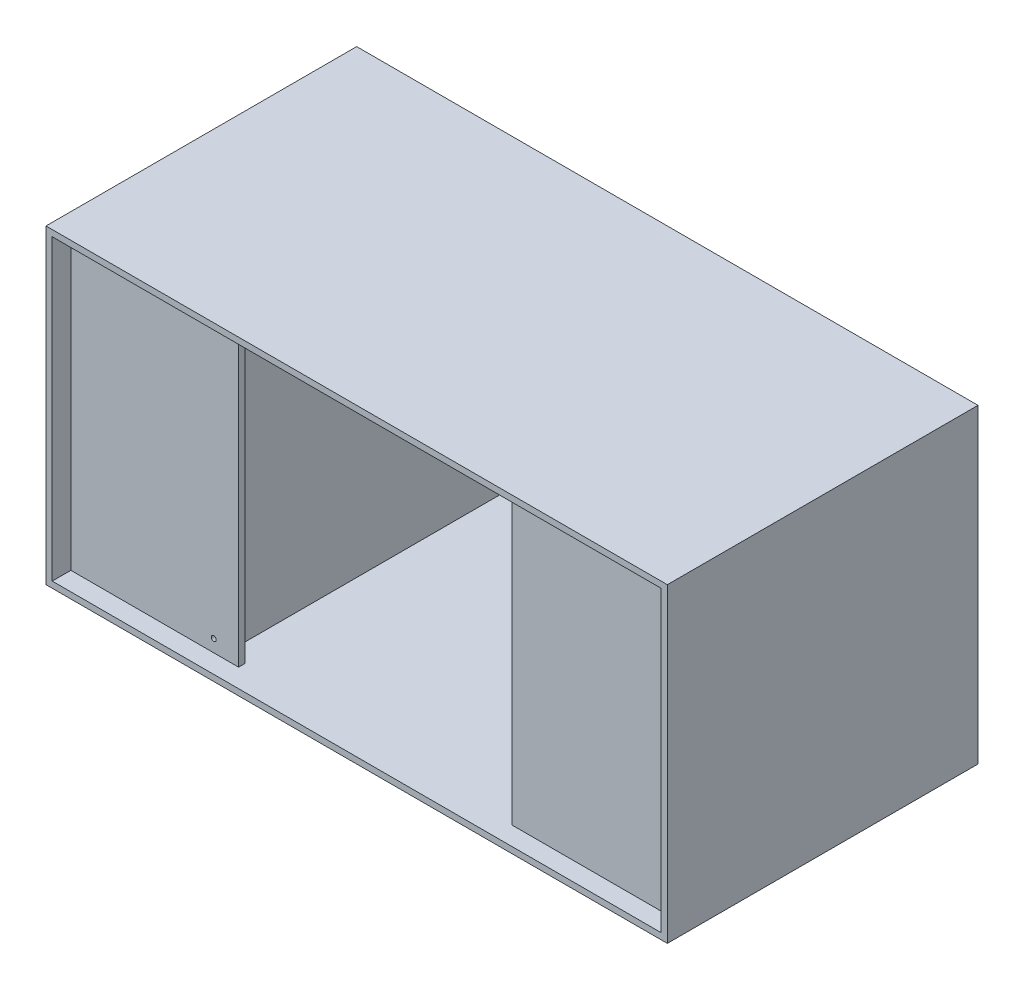
ISO-10303-21;
HEADER;
FILE_DESCRIPTION(('STEP AP214'),'2;1');
FILE_NAME('part.step','',(''),(''),'','','');
FILE_SCHEMA(('AUTOMOTIVE_DESIGN { 1 0 10303 214 1 1 1 1 }'));
ENDSEC;
DATA;
#1=APPLICATION_CONTEXT('core data for automotive mechanical design processes');
#2=APPLICATION_PROTOCOL_DEFINITION('international standard','automotive_design',2000,#1);
#3=PRODUCT_CONTEXT('',#1,'mechanical');
#4=PRODUCT('Part','Part','',(#3));
#5=PRODUCT_RELATED_PRODUCT_CATEGORY('part','',(#4));
#6=PRODUCT_DEFINITION_FORMATION('','',#4);
#7=PRODUCT_DEFINITION_CONTEXT('part definition',#1,'design');
#8=PRODUCT_DEFINITION('design','',#6,#7);
#9=PRODUCT_DEFINITION_SHAPE('','',#8);
#10=(LENGTH_UNIT() NAMED_UNIT(*) SI_UNIT(.MILLI.,.METRE.));
#11=(NAMED_UNIT(*) PLANE_ANGLE_UNIT() SI_UNIT($,.RADIAN.));
#12=(NAMED_UNIT(*) SI_UNIT($,.STERADIAN.) SOLID_ANGLE_UNIT());
#13=UNCERTAINTY_MEASURE_WITH_UNIT(LENGTH_MEASURE(1.E-05),#10,'distance_accuracy_value','');
#14=(GEOMETRIC_REPRESENTATION_CONTEXT(3) GLOBAL_UNCERTAINTY_ASSIGNED_CONTEXT((#13)) GLOBAL_UNIT_ASSIGNED_CONTEXT((#10,
#11,#12)) REPRESENTATION_CONTEXT('',''));
#15=CARTESIAN_POINT('',(0.,0.,0.));
#16=DIRECTION('',(0.,0.,1.));
#17=DIRECTION('',(1.,0.,0.));
#18=AXIS2_PLACEMENT_3D('',#15,#16,#17);
#19=CARTESIAN_POINT('',(0.,0.,-240.));
#20=DIRECTION('',(0.,0.,1.));
#21=DIRECTION('',(1.,0.,0.));
#22=AXIS2_PLACEMENT_3D('',#19,#20,#21);
#23=PLANE('',#22);
#24=DIRECTION('',(0.,1.,0.));
#25=VECTOR('',#24,1.);
#26=CARTESIAN_POINT('',(250.,240.,-240.));
#27=LINE('',#26,#25);
#28=CARTESIAN_POINT('',(250.,-240.000000000004,-240.));
#29=VERTEX_POINT('',#28);
#30=CARTESIAN_POINT('',(250.,240.,-240.));
#31=VERTEX_POINT('',#30);
#32=EDGE_CURVE('E253',#29,#31,#27,.T.);
#33=ORIENTED_EDGE('',*,*,#32,.T.);
#34=DIRECTION('',(-1.,0.,0.));
#35=VECTOR('',#34,1.);
#36=CARTESIAN_POINT('',(500.,240.,-240.));
#37=LINE('',#36,#35);
#38=CARTESIAN_POINT('',(-250.,240.,-240.));
#39=VERTEX_POINT('',#38);
#40=EDGE_CURVE('E392',#31,#39,#37,.T.);
#41=ORIENTED_EDGE('',*,*,#40,.T.);
#42=DIRECTION('',(0.,-1.,0.));
#43=VECTOR('',#42,1.);
#44=CARTESIAN_POINT('',(-250.,0.,-240.));
#45=LINE('',#44,#43);
#46=CARTESIAN_POINT('',(-250.,-240.,-240.));
#47=VERTEX_POINT('',#46);
#48=EDGE_CURVE('E274',#39,#47,#45,.T.);
#49=ORIENTED_EDGE('',*,*,#48,.T.);
#50=DIRECTION('',(1.,0.,0.));
#51=VECTOR('',#50,1.);
#52=CARTESIAN_POINT('',(500.,-240.,-240.));
#53=LINE('',#52,#51);
#54=EDGE_CURVE('E378',#47,#29,#53,.T.);
#55=ORIENTED_EDGE('',*,*,#54,.T.);
#56=EDGE_LOOP('',(#33,#41,#49,#55));
#57=FACE_BOUND('',#56,.T.);
#58=DIRECTION('',(1.,0.,0.));
#59=VECTOR('',#58,1.);
#60=CARTESIAN_POINT('',(0.,200.,-240.));
#61=LINE('',#60,#59);
#62=CARTESIAN_POINT('',(-200.,200.,-240.));
#63=VERTEX_POINT('',#62);
#64=CARTESIAN_POINT('',(200.,200.,-240.));
#65=VERTEX_POINT('',#64);
#66=EDGE_CURVE('E44',#63,#65,#61,.T.);
#67=ORIENTED_EDGE('',*,*,#66,.T.);
#68=DIRECTION('',(0.,-1.,0.));
#69=VECTOR('',#68,1.);
#70=CARTESIAN_POINT('',(200.,0.,-240.));
#71=LINE('',#70,#69);
#72=CARTESIAN_POINT('',(200.,-200.,-240.));
#73=VERTEX_POINT('',#72);
#74=EDGE_CURVE('E11',#65,#73,#71,.T.);
#75=ORIENTED_EDGE('',*,*,#74,.T.);
#76=DIRECTION('',(-1.,0.,0.));
#77=VECTOR('',#76,1.);
#78=CARTESIAN_POINT('',(0.,-200.,-240.));
#79=LINE('',#78,#77);
#80=CARTESIAN_POINT('',(-200.,-200.,-240.));
#81=VERTEX_POINT('',#80);
#82=EDGE_CURVE('E430',#73,#81,#79,.T.);
#83=ORIENTED_EDGE('',*,*,#82,.T.);
#84=DIRECTION('',(0.,-1.,0.));
#85=VECTOR('',#84,1.);
#86=CARTESIAN_POINT('',(-200.,0.,-240.));
#87=LINE('',#86,#85);
#88=EDGE_CURVE('E433',#63,#81,#87,.T.);
#89=ORIENTED_EDGE('',*,*,#88,.F.);
#90=EDGE_LOOP('',(#67,#75,#83,#89));
#91=FACE_BOUND('',#90,.T.);
#92=ADVANCED_FACE('F34',(#57,#91),#23,.T.);
#93=CARTESIAN_POINT('',(500.,-240.,250.));
#94=DIRECTION('',(0.,1.,0.));
#95=DIRECTION('',(-1.,0.,0.));
#96=AXIS2_PLACEMENT_3D('',#93,#94,#95);
#97=PLANE('',#96);
#98=DIRECTION('',(0.,0.,-1.));
#99=VECTOR('',#98,1.);
#100=CARTESIAN_POINT('',(250.,-240.000000000004,-240.));
#101=LINE('',#100,#99);
#102=CARTESIAN_POINT('',(250.,-240.000000000004,210.));
#103=VERTEX_POINT('',#102);
#104=EDGE_CURVE('E262',#103,#29,#101,.T.);
#105=ORIENTED_EDGE('',*,*,#104,.T.);
#106=ORIENTED_EDGE('',*,*,#54,.F.);
#107=DIRECTION('',(0.,0.,1.));
#108=VECTOR('',#107,1.);
#109=CARTESIAN_POINT('',(-250.,-240.,250.));
#110=LINE('',#109,#108);
#111=CARTESIAN_POINT('',(-250.,-240.000000000005,210.));
#112=VERTEX_POINT('',#111);
#113=EDGE_CURVE('E276',#47,#112,#110,.T.);
#114=ORIENTED_EDGE('',*,*,#113,.T.);
#115=DIRECTION('',(1.,0.,0.));
#116=VECTOR('',#115,1.);
#117=CARTESIAN_POINT('',(-490.,-240.000000000005,210.));
#118=LINE('',#117,#116);
#119=CARTESIAN_POINT('',(-219.999999999996,-240.000000000005,210.));
#120=VERTEX_POINT('',#119);
#121=EDGE_CURVE('E326',#112,#120,#118,.T.);
#122=ORIENTED_EDGE('',*,*,#121,.T.);
#123=DIRECTION('',(0.,0.,-1.));
#124=VECTOR('',#123,1.);
#125=CARTESIAN_POINT('',(-219.999999999996,-240.000000000005,220.));
#126=LINE('',#125,#124);
#127=CARTESIAN_POINT('',(-219.999999999996,-240.000000000005,220.));
#128=VERTEX_POINT('',#127);
#129=EDGE_CURVE('E337',#128,#120,#126,.T.);
#130=ORIENTED_EDGE('',*,*,#129,.F.);
#131=DIRECTION('',(1.,0.,0.));
#132=VECTOR('',#131,1.);
#133=CARTESIAN_POINT('',(-490.,-240.000000000005,220.));
#134=LINE('',#133,#132);
#135=CARTESIAN_POINT('',(-490.,-240.000000000005,220.));
#136=VERTEX_POINT('',#135);
#137=EDGE_CURVE('E316',#136,#128,#134,.T.);
#138=ORIENTED_EDGE('',*,*,#137,.F.);
#139=DIRECTION('',(0.,0.,-1.));
#140=VECTOR('',#139,1.);
#141=CARTESIAN_POINT('',(-490.,-240.,250.));
#142=LINE('',#141,#140);
#143=CARTESIAN_POINT('',(-490.,-240.,250.));
#144=VERTEX_POINT('',#143);
#145=EDGE_CURVE('E364',#144,#136,#142,.T.);
#146=ORIENTED_EDGE('',*,*,#145,.F.);
#147=DIRECTION('',(1.,0.,0.));
#148=VECTOR('',#147,1.);
#149=CARTESIAN_POINT('',(500.,-240.,250.));
#150=LINE('',#149,#148);
#151=CARTESIAN_POINT('',(490.,-240.,250.));
#152=VERTEX_POINT('',#151);
#153=EDGE_CURVE('E394',#144,#152,#150,.T.);
#154=ORIENTED_EDGE('',*,*,#153,.T.);
#155=DIRECTION('',(0.,0.,-1.));
#156=VECTOR('',#155,1.);
#157=CARTESIAN_POINT('',(490.,-240.,250.));
#158=LINE('',#157,#156);
#159=CARTESIAN_POINT('',(490.000000000003,-240.000000000004,220.));
#160=VERTEX_POINT('',#159);
#161=EDGE_CURVE('E379',#152,#160,#158,.T.);
#162=ORIENTED_EDGE('',*,*,#161,.T.);
#163=DIRECTION('',(1.,0.,0.));
#164=VECTOR('',#163,1.);
#165=CARTESIAN_POINT('',(220.,-240.000000000004,220.));
#166=LINE('',#165,#164);
#167=CARTESIAN_POINT('',(220.,-240.000000000004,220.));
#168=VERTEX_POINT('',#167);
#169=EDGE_CURVE('E294',#168,#160,#166,.T.);
#170=ORIENTED_EDGE('',*,*,#169,.F.);
#171=DIRECTION('',(0.,0.,-1.));
#172=VECTOR('',#171,1.);
#173=CARTESIAN_POINT('',(220.,-240.000000000004,220.));
#174=LINE('',#173,#172);
#175=CARTESIAN_POINT('',(220.,-240.000000000004,210.));
#176=VERTEX_POINT('',#175);
#177=EDGE_CURVE('E310',#168,#176,#174,.T.);
#178=ORIENTED_EDGE('',*,*,#177,.T.);
#179=DIRECTION('',(1.,0.,0.));
#180=VECTOR('',#179,1.);
#181=CARTESIAN_POINT('',(220.,-240.000000000004,210.));
#182=LINE('',#181,#180);
#183=EDGE_CURVE('E238',#176,#103,#182,.T.);
#184=ORIENTED_EDGE('',*,*,#183,.T.);
#185=EDGE_LOOP('',(#105,#106,#114,#122,#130,#138,#146,#154,#162,#170,#178,#184));
#186=FACE_BOUND('',#185,.T.);
#187=ADVANCED_FACE('F467',(#186),#97,.T.);
#188=CARTESIAN_POINT('',(500.,240.,250.));
#189=DIRECTION('',(0.,-1.,0.));
#190=DIRECTION('',(1.,0.,0.));
#191=AXIS2_PLACEMENT_3D('',#188,#189,#190);
#192=PLANE('',#191);
#193=DIRECTION('',(0.,0.,1.));
#194=VECTOR('',#193,1.);
#195=CARTESIAN_POINT('',(250.,240.,-240.));
#196=LINE('',#195,#194);
#197=CARTESIAN_POINT('',(250.,240.,210.));
#198=VERTEX_POINT('',#197);
#199=EDGE_CURVE('E256',#31,#198,#196,.T.);
#200=ORIENTED_EDGE('',*,*,#199,.T.);
#201=DIRECTION('',(-1.,0.,0.));
#202=VECTOR('',#201,1.);
#203=CARTESIAN_POINT('',(220.,240.,210.));
#204=LINE('',#203,#202);
#205=CARTESIAN_POINT('',(220.,240.,210.));
#206=VERTEX_POINT('',#205);
#207=EDGE_CURVE('E306',#198,#206,#204,.T.);
#208=ORIENTED_EDGE('',*,*,#207,.T.);
#209=DIRECTION('',(0.,0.,-1.));
#210=VECTOR('',#209,1.);
#211=CARTESIAN_POINT('',(220.,240.,220.));
#212=LINE('',#211,#210);
#213=CARTESIAN_POINT('',(220.,240.,220.));
#214=VERTEX_POINT('',#213);
#215=EDGE_CURVE('E301',#214,#206,#212,.T.);
#216=ORIENTED_EDGE('',*,*,#215,.F.);
#217=DIRECTION('',(-1.,0.,0.));
#218=VECTOR('',#217,1.);
#219=CARTESIAN_POINT('',(220.,240.,220.));
#220=LINE('',#219,#218);
#221=CARTESIAN_POINT('',(490.000000000003,240.,220.));
#222=VERTEX_POINT('',#221);
#223=EDGE_CURVE('E299',#222,#214,#220,.T.);
#224=ORIENTED_EDGE('',*,*,#223,.F.);
#225=DIRECTION('',(0.,0.,-1.));
#226=VECTOR('',#225,1.);
#227=CARTESIAN_POINT('',(490.,240.,250.));
#228=LINE('',#227,#226);
#229=CARTESIAN_POINT('',(490.,240.,250.));
#230=VERTEX_POINT('',#229);
#231=EDGE_CURVE('E386',#230,#222,#228,.T.);
#232=ORIENTED_EDGE('',*,*,#231,.F.);
#233=DIRECTION('',(-1.,0.,0.));
#234=VECTOR('',#233,1.);
#235=CARTESIAN_POINT('',(500.,240.,250.));
#236=LINE('',#235,#234);
#237=CARTESIAN_POINT('',(-490.,240.,250.));
#238=VERTEX_POINT('',#237);
#239=EDGE_CURVE('E399',#230,#238,#236,.T.);
#240=ORIENTED_EDGE('',*,*,#239,.T.);
#241=DIRECTION('',(0.,0.,-1.));
#242=VECTOR('',#241,1.);
#243=CARTESIAN_POINT('',(-490.,240.,250.));
#244=LINE('',#243,#242);
#245=CARTESIAN_POINT('',(-490.,240.,220.));
#246=VERTEX_POINT('',#245);
#247=EDGE_CURVE('E369',#238,#246,#244,.T.);
#248=ORIENTED_EDGE('',*,*,#247,.T.);
#249=DIRECTION('',(-1.,0.,0.));
#250=VECTOR('',#249,1.);
#251=CARTESIAN_POINT('',(-490.,240.,220.));
#252=LINE('',#251,#250);
#253=CARTESIAN_POINT('',(-219.999999999996,240.,220.));
#254=VERTEX_POINT('',#253);
#255=EDGE_CURVE('E321',#254,#246,#252,.T.);
#256=ORIENTED_EDGE('',*,*,#255,.F.);
#257=DIRECTION('',(0.,0.,-1.));
#258=VECTOR('',#257,1.);
#259=CARTESIAN_POINT('',(-219.999999999996,240.,220.));
#260=LINE('',#259,#258);
#261=CARTESIAN_POINT('',(-219.999999999996,240.,210.));
#262=VERTEX_POINT('',#261);
#263=EDGE_CURVE('E323',#254,#262,#260,.T.);
#264=ORIENTED_EDGE('',*,*,#263,.T.);
#265=DIRECTION('',(-1.,0.,0.));
#266=VECTOR('',#265,1.);
#267=CARTESIAN_POINT('',(-490.,240.,210.));
#268=LINE('',#267,#266);
#269=CARTESIAN_POINT('',(-250.,240.,210.));
#270=VERTEX_POINT('',#269);
#271=EDGE_CURVE('E317',#262,#270,#268,.T.);
#272=ORIENTED_EDGE('',*,*,#271,.T.);
#273=DIRECTION('',(0.,0.,-1.));
#274=VECTOR('',#273,1.);
#275=CARTESIAN_POINT('',(-250.,240.,250.));
#276=LINE('',#275,#274);
#277=EDGE_CURVE('E271',#270,#39,#276,.T.);
#278=ORIENTED_EDGE('',*,*,#277,.T.);
#279=ORIENTED_EDGE('',*,*,#40,.F.);
#280=EDGE_LOOP('',(#200,#208,#216,#224,#232,#240,#248,#256,#264,#272,#278,#279));
#281=FACE_BOUND('',#280,.T.);
#282=ADVANCED_FACE('F475',(#281),#192,.T.);
#283=CARTESIAN_POINT('',(0.,0.,210.));
#284=DIRECTION('',(0.,0.,1.));
#285=DIRECTION('',(1.,0.,0.));
#286=AXIS2_PLACEMENT_3D('',#283,#284,#285);
#287=PLANE('',#286);
#288=DIRECTION('',(0.,-1.,0.));
#289=VECTOR('',#288,1.);
#290=CARTESIAN_POINT('',(-250.,250.,210.));
#291=LINE('',#290,#289);
#292=EDGE_CURVE('E246',#270,#112,#291,.T.);
#293=ORIENTED_EDGE('',*,*,#292,.F.);
#294=ORIENTED_EDGE('',*,*,#271,.F.);
#295=DIRECTION('',(0.,1.,0.));
#296=VECTOR('',#295,1.);
#297=CARTESIAN_POINT('',(-219.999999999996,240.,210.));
#298=LINE('',#297,#296);
#299=EDGE_CURVE('E330',#120,#262,#298,.T.);
#300=ORIENTED_EDGE('',*,*,#299,.F.);
#301=ORIENTED_EDGE('',*,*,#121,.F.);
#302=EDGE_LOOP('',(#293,#294,#300,#301));
#303=FACE_BOUND('',#302,.T.);
#304=ADVANCED_FACE('F537',(#303),#287,.F.);
#305=CARTESIAN_POINT('',(-490.,-250.,250.));
#306=DIRECTION('',(1.,0.,0.));
#307=DIRECTION('',(0.,0.,-1.));
#308=AXIS2_PLACEMENT_3D('',#305,#306,#307);
#309=PLANE('',#308);
#310=CARTESIAN_POINT('',(-490.,240.,210.));
#311=VERTEX_POINT('',#310);
#312=CARTESIAN_POINT('',(-490.,240.,-240.));
#313=VERTEX_POINT('',#312);
#314=EDGE_CURVE('E373',#311,#313,#244,.T.);
#315=ORIENTED_EDGE('',*,*,#314,.F.);
#316=DIRECTION('',(0.,-1.,0.));
#317=VECTOR('',#316,1.);
#318=CARTESIAN_POINT('',(-490.,240.,210.));
#319=LINE('',#318,#317);
#320=CARTESIAN_POINT('',(-490.,-240.000000000005,210.));
#321=VERTEX_POINT('',#320);
#322=EDGE_CURVE('E313',#311,#321,#319,.T.);
#323=ORIENTED_EDGE('',*,*,#322,.T.);
#324=CARTESIAN_POINT('',(-490.,-240.,-240.));
#325=VERTEX_POINT('',#324);
#326=EDGE_CURVE('E368',#321,#325,#142,.T.);
#327=ORIENTED_EDGE('',*,*,#326,.T.);
#328=DIRECTION('',(0.,-1.,0.));
#329=VECTOR('',#328,1.);
#330=CARTESIAN_POINT('',(-490.,-250.,-240.));
#331=LINE('',#330,#329);
#332=EDGE_CURVE('E361',#313,#325,#331,.T.);
#333=ORIENTED_EDGE('',*,*,#332,.F.);
#334=EDGE_LOOP('',(#315,#323,#327,#333));
#335=FACE_BOUND('',#334,.T.);
#336=ADVANCED_FACE('F542',(#335),#309,.T.);
#337=CARTESIAN_POINT('',(0.,0.,-250.));
#338=DIRECTION('',(0.,0.,1.));
#339=DIRECTION('',(1.,0.,0.));
#340=AXIS2_PLACEMENT_3D('',#337,#338,#339);
#341=PLANE('',#340);
#342=DIRECTION('',(0.,-1.,0.));
#343=VECTOR('',#342,1.);
#344=CARTESIAN_POINT('',(-500.,-250.,-250.));
#345=LINE('',#344,#343);
#346=CARTESIAN_POINT('',(-500.,250.,-250.));
#347=VERTEX_POINT('',#346);
#348=CARTESIAN_POINT('',(-500.,-250.,-250.));
#349=VERTEX_POINT('',#348);
#350=EDGE_CURVE('E367',#347,#349,#345,.T.);
#351=ORIENTED_EDGE('',*,*,#350,.F.);
#352=DIRECTION('',(-1.,0.,0.));
#353=VECTOR('',#352,1.);
#354=CARTESIAN_POINT('',(500.,250.,-250.));
#355=LINE('',#354,#353);
#356=CARTESIAN_POINT('',(500.,250.,-250.));
#357=VERTEX_POINT('',#356);
#358=EDGE_CURVE('E405',#357,#347,#355,.T.);
#359=ORIENTED_EDGE('',*,*,#358,.F.);
#360=DIRECTION('',(0.,1.,0.));
#361=VECTOR('',#360,1.);
#362=CARTESIAN_POINT('',(500.,-250.,-250.));
#363=LINE('',#362,#361);
#364=CARTESIAN_POINT('',(500.,-250.,-250.));
#365=VERTEX_POINT('',#364);
#366=EDGE_CURVE('E416',#365,#357,#363,.T.);
#367=ORIENTED_EDGE('',*,*,#366,.F.);
#368=DIRECTION('',(1.,0.,0.));
#369=VECTOR('',#368,1.);
#370=CARTESIAN_POINT('',(500.,-250.,-250.));
#371=LINE('',#370,#369);
#372=EDGE_CURVE('E414',#349,#365,#371,.T.);
#373=ORIENTED_EDGE('',*,*,#372,.F.);
#374=EDGE_LOOP('',(#351,#359,#367,#373));
#375=FACE_BOUND('',#374,.T.);
#376=DIRECTION('',(0.,-1.,0.));
#377=VECTOR('',#376,1.);
#378=CARTESIAN_POINT('',(200.,0.,-250.));
#379=LINE('',#378,#377);
#380=CARTESIAN_POINT('',(200.,200.,-250.));
#381=VERTEX_POINT('',#380);
#382=CARTESIAN_POINT('',(200.,-200.,-250.));
#383=VERTEX_POINT('',#382);
#384=EDGE_CURVE('E358',#381,#383,#379,.T.);
#385=ORIENTED_EDGE('',*,*,#384,.F.);
#386=DIRECTION('',(1.,0.,0.));
#387=VECTOR('',#386,1.);
#388=CARTESIAN_POINT('',(0.,200.,-250.));
#389=LINE('',#388,#387);
#390=CARTESIAN_POINT('',(-200.,200.,-250.));
#391=VERTEX_POINT('',#390);
#392=EDGE_CURVE('E356',#391,#381,#389,.T.);
#393=ORIENTED_EDGE('',*,*,#392,.F.);
#394=DIRECTION('',(0.,-1.,0.));
#395=VECTOR('',#394,1.);
#396=CARTESIAN_POINT('',(-200.,0.,-250.));
#397=LINE('',#396,#395);
#398=CARTESIAN_POINT('',(-200.,-200.,-250.));
#399=VERTEX_POINT('',#398);
#400=EDGE_CURVE('E353',#391,#399,#397,.T.);
#401=ORIENTED_EDGE('',*,*,#400,.T.);
#402=DIRECTION('',(-1.,0.,0.));
#403=VECTOR('',#402,1.);
#404=CARTESIAN_POINT('',(0.,-200.,-250.));
#405=LINE('',#404,#403);
#406=EDGE_CURVE('E351',#383,#399,#405,.T.);
#407=ORIENTED_EDGE('',*,*,#406,.F.);
#408=EDGE_LOOP('',(#385,#393,#401,#407));
#409=FACE_BOUND('',#408,.T.);
#410=ADVANCED_FACE('F449',(#375,#409),#341,.F.);
#411=DIRECTION('',(0.,-1.,0.));
#412=VECTOR('',#411,1.);
#413=CARTESIAN_POINT('',(-260.,0.,-240.));
#414=LINE('',#413,#412);
#415=CARTESIAN_POINT('',(-260.,240.,-240.));
#416=VERTEX_POINT('',#415);
#417=CARTESIAN_POINT('',(-260.,-240.,-240.));
#418=VERTEX_POINT('',#417);
#419=EDGE_CURVE('E282',#416,#418,#414,.T.);
#420=ORIENTED_EDGE('',*,*,#419,.F.);
#421=EDGE_CURVE('E385',#416,#313,#37,.T.);
#422=ORIENTED_EDGE('',*,*,#421,.T.);
#423=ORIENTED_EDGE('',*,*,#332,.T.);
#424=EDGE_CURVE('E374',#325,#418,#53,.T.);
#425=ORIENTED_EDGE('',*,*,#424,.T.);
#426=EDGE_LOOP('',(#420,#422,#423,#425));
#427=FACE_BOUND('',#426,.T.);
#428=ADVANCED_FACE('F470',(#427),#23,.T.);
#429=CARTESIAN_POINT('',(-500.,-250.,250.));
#430=DIRECTION('',(1.,0.,0.));
#431=DIRECTION('',(0.,0.,-1.));
#432=AXIS2_PLACEMENT_3D('',#429,#430,#431);
#433=PLANE('',#432);
#434=ORIENTED_EDGE('',*,*,#350,.T.);
#435=DIRECTION('',(0.,0.,-1.));
#436=VECTOR('',#435,1.);
#437=CARTESIAN_POINT('',(-500.,-250.,250.));
#438=LINE('',#437,#436);
#439=CARTESIAN_POINT('',(-500.,-250.,250.));
#440=VERTEX_POINT('',#439);
#441=EDGE_CURVE('E427',#440,#349,#438,.T.);
#442=ORIENTED_EDGE('',*,*,#441,.F.);
#443=DIRECTION('',(0.,-1.,0.));
#444=VECTOR('',#443,1.);
#445=CARTESIAN_POINT('',(-500.,-250.,250.));
#446=LINE('',#445,#444);
#447=CARTESIAN_POINT('',(-500.,250.,250.));
#448=VERTEX_POINT('',#447);
#449=EDGE_CURVE('E401',#448,#440,#446,.T.);
#450=ORIENTED_EDGE('',*,*,#449,.F.);
#451=DIRECTION('',(0.,0.,-1.));
#452=VECTOR('',#451,1.);
#453=CARTESIAN_POINT('',(-500.,250.,250.));
#454=LINE('',#453,#452);
#455=EDGE_CURVE('E411',#448,#347,#454,.T.);
#456=ORIENTED_EDGE('',*,*,#455,.T.);
#457=EDGE_LOOP('',(#434,#442,#450,#456));
#458=FACE_BOUND('',#457,.T.);
#459=ADVANCED_FACE('F36',(#458),#433,.F.);
#460=CARTESIAN_POINT('',(500.,-250.,250.));
#461=DIRECTION('',(0.,1.,0.));
#462=DIRECTION('',(-1.,0.,0.));
#463=AXIS2_PLACEMENT_3D('',#460,#461,#462);
#464=PLANE('',#463);
#465=ORIENTED_EDGE('',*,*,#372,.T.);
#466=DIRECTION('',(0.,0.,-1.));
#467=VECTOR('',#466,1.);
#468=CARTESIAN_POINT('',(500.,-250.,250.));
#469=LINE('',#468,#467);
#470=CARTESIAN_POINT('',(500.,-250.,250.));
#471=VERTEX_POINT('',#470);
#472=EDGE_CURVE('E424',#471,#365,#469,.T.);
#473=ORIENTED_EDGE('',*,*,#472,.F.);
#474=DIRECTION('',(1.,0.,0.));
#475=VECTOR('',#474,1.);
#476=CARTESIAN_POINT('',(500.,-250.,250.));
#477=LINE('',#476,#475);
#478=EDGE_CURVE('E404',#440,#471,#477,.T.);
#479=ORIENTED_EDGE('',*,*,#478,.F.);
#480=ORIENTED_EDGE('',*,*,#441,.T.);
#481=EDGE_LOOP('',(#465,#473,#479,#480));
#482=FACE_BOUND('',#481,.T.);
#483=ADVANCED_FACE('F760',(#482),#464,.F.);
#484=CARTESIAN_POINT('',(500.,-250.,250.));
#485=DIRECTION('',(-1.,0.,0.));
#486=DIRECTION('',(0.,-1.,0.));
#487=AXIS2_PLACEMENT_3D('',#484,#485,#486);
#488=PLANE('',#487);
#489=ORIENTED_EDGE('',*,*,#366,.T.);
#490=DIRECTION('',(0.,0.,-1.));
#491=VECTOR('',#490,1.);
#492=CARTESIAN_POINT('',(500.,250.,250.));
#493=LINE('',#492,#491);
#494=CARTESIAN_POINT('',(500.,250.,250.));
#495=VERTEX_POINT('',#494);
#496=EDGE_CURVE('E421',#495,#357,#493,.T.);
#497=ORIENTED_EDGE('',*,*,#496,.F.);
#498=DIRECTION('',(0.,1.,0.));
#499=VECTOR('',#498,1.);
#500=CARTESIAN_POINT('',(500.,-250.,250.));
#501=LINE('',#500,#499);
#502=EDGE_CURVE('E407',#471,#495,#501,.T.);
#503=ORIENTED_EDGE('',*,*,#502,.F.);
#504=ORIENTED_EDGE('',*,*,#472,.T.);
#505=EDGE_LOOP('',(#489,#497,#503,#504));
#506=FACE_BOUND('',#505,.T.);
#507=ADVANCED_FACE('F768',(#506),#488,.F.);
#508=CARTESIAN_POINT('',(500.,250.,250.));
#509=DIRECTION('',(0.,-1.,0.));
#510=DIRECTION('',(1.,0.,0.));
#511=AXIS2_PLACEMENT_3D('',#508,#509,#510);
#512=PLANE('',#511);
#513=ORIENTED_EDGE('',*,*,#358,.T.);
#514=ORIENTED_EDGE('',*,*,#455,.F.);
#515=DIRECTION('',(-1.,0.,0.));
#516=VECTOR('',#515,1.);
#517=CARTESIAN_POINT('',(500.,250.,250.));
#518=LINE('',#517,#516);
#519=EDGE_CURVE('E409',#495,#448,#518,.T.);
#520=ORIENTED_EDGE('',*,*,#519,.F.);
#521=ORIENTED_EDGE('',*,*,#496,.T.);
#522=EDGE_LOOP('',(#513,#514,#520,#521));
#523=FACE_BOUND('',#522,.T.);
#524=ADVANCED_FACE('F775',(#523),#512,.F.);
#525=CARTESIAN_POINT('',(0.,0.,250.));
#526=DIRECTION('',(0.,0.,1.));
#527=DIRECTION('',(1.,0.,0.));
#528=AXIS2_PLACEMENT_3D('',#525,#526,#527);
#529=PLANE('',#528);
#530=DIRECTION('',(0.,-1.,0.));
#531=VECTOR('',#530,1.);
#532=CARTESIAN_POINT('',(-490.,-250.,250.));
#533=LINE('',#532,#531);
#534=EDGE_CURVE('E391',#238,#144,#533,.T.);
#535=ORIENTED_EDGE('',*,*,#534,.F.);
#536=ORIENTED_EDGE('',*,*,#239,.F.);
#537=DIRECTION('',(0.,1.,0.));
#538=VECTOR('',#537,1.);
#539=CARTESIAN_POINT('',(490.,-250.,250.));
#540=LINE('',#539,#538);
#541=EDGE_CURVE('E396',#152,#230,#540,.T.);
#542=ORIENTED_EDGE('',*,*,#541,.F.);
#543=ORIENTED_EDGE('',*,*,#153,.F.);
#544=EDGE_LOOP('',(#535,#536,#542,#543));
#545=FACE_BOUND('',#544,.T.);
#546=ORIENTED_EDGE('',*,*,#449,.T.);
#547=ORIENTED_EDGE('',*,*,#478,.T.);
#548=ORIENTED_EDGE('',*,*,#502,.T.);
#549=ORIENTED_EDGE('',*,*,#519,.T.);
#550=EDGE_LOOP('',(#546,#547,#548,#549));
#551=FACE_BOUND('',#550,.T.);
#552=ADVANCED_FACE('F597',(#545,#551),#529,.T.);
#553=DIRECTION('',(0.,-1.,0.));
#554=VECTOR('',#553,1.);
#555=CARTESIAN_POINT('',(-490.,240.,220.));
#556=LINE('',#555,#554);
#557=EDGE_CURVE('E314',#246,#136,#556,.T.);
#558=ORIENTED_EDGE('',*,*,#557,.F.);
#559=ORIENTED_EDGE('',*,*,#247,.F.);
#560=ORIENTED_EDGE('',*,*,#534,.T.);
#561=ORIENTED_EDGE('',*,*,#145,.T.);
#562=EDGE_LOOP('',(#558,#559,#560,#561));
#563=FACE_BOUND('',#562,.T.);
#564=ADVANCED_FACE('F550',(#563),#309,.T.);
#565=DIRECTION('',(0.,0.,1.));
#566=VECTOR('',#565,1.);
#567=CARTESIAN_POINT('',(-260.,-240.,250.));
#568=LINE('',#567,#566);
#569=CARTESIAN_POINT('',(-260.,-240.000000000005,210.));
#570=VERTEX_POINT('',#569);
#571=EDGE_CURVE('E285',#418,#570,#568,.T.);
#572=ORIENTED_EDGE('',*,*,#571,.F.);
#573=ORIENTED_EDGE('',*,*,#424,.F.);
#574=ORIENTED_EDGE('',*,*,#326,.F.);
#575=EDGE_CURVE('E327',#321,#570,#118,.T.);
#576=ORIENTED_EDGE('',*,*,#575,.T.);
#577=EDGE_LOOP('',(#572,#573,#574,#576));
#578=FACE_BOUND('',#577,.T.);
#579=ADVANCED_FACE('F478',(#578),#97,.T.);
#580=CARTESIAN_POINT('',(490.,-250.,250.));
#581=DIRECTION('',(-1.,0.,0.));
#582=DIRECTION('',(0.,-1.,0.));
#583=AXIS2_PLACEMENT_3D('',#580,#581,#582);
#584=PLANE('',#583);
#585=DIRECTION('',(0.,1.,0.));
#586=VECTOR('',#585,1.);
#587=CARTESIAN_POINT('',(490.000000000003,240.,220.));
#588=LINE('',#587,#586);
#589=EDGE_CURVE('E297',#160,#222,#588,.T.);
#590=ORIENTED_EDGE('',*,*,#589,.F.);
#591=ORIENTED_EDGE('',*,*,#161,.F.);
#592=ORIENTED_EDGE('',*,*,#541,.T.);
#593=ORIENTED_EDGE('',*,*,#231,.T.);
#594=EDGE_LOOP('',(#590,#591,#592,#593));
#595=FACE_BOUND('',#594,.T.);
#596=ADVANCED_FACE('F498',(#595),#584,.T.);
#597=DIRECTION('',(0.,0.,-1.));
#598=VECTOR('',#597,1.);
#599=CARTESIAN_POINT('',(-260.,240.,250.));
#600=LINE('',#599,#598);
#601=CARTESIAN_POINT('',(-260.,240.,210.));
#602=VERTEX_POINT('',#601);
#603=EDGE_CURVE('E279',#602,#416,#600,.T.);
#604=ORIENTED_EDGE('',*,*,#603,.F.);
#605=EDGE_CURVE('E332',#602,#311,#268,.T.);
#606=ORIENTED_EDGE('',*,*,#605,.T.);
#607=ORIENTED_EDGE('',*,*,#314,.T.);
#608=ORIENTED_EDGE('',*,*,#421,.F.);
#609=EDGE_LOOP('',(#604,#606,#607,#608));
#610=FACE_BOUND('',#609,.T.);
#611=ADVANCED_FACE('F552',(#610),#192,.T.);
#612=CARTESIAN_POINT('',(200.,-200.,0.));
#613=DIRECTION('',(-1.,0.,0.));
#614=DIRECTION('',(0.,0.,1.));
#615=AXIS2_PLACEMENT_3D('',#612,#613,#614);
#616=PLANE('',#615);
#617=ORIENTED_EDGE('',*,*,#384,.T.);
#618=DIRECTION('',(0.,0.,-1.));
#619=VECTOR('',#618,1.);
#620=CARTESIAN_POINT('',(200.,-200.,0.));
#621=LINE('',#620,#619);
#622=EDGE_CURVE('E340',#73,#383,#621,.T.);
#623=ORIENTED_EDGE('',*,*,#622,.F.);
#624=ORIENTED_EDGE('',*,*,#74,.F.);
#625=DIRECTION('',(0.,0.,-1.));
#626=VECTOR('',#625,1.);
#627=CARTESIAN_POINT('',(200.,200.,0.));
#628=LINE('',#627,#626);
#629=EDGE_CURVE('E348',#65,#381,#628,.T.);
#630=ORIENTED_EDGE('',*,*,#629,.T.);
#631=EDGE_LOOP('',(#617,#623,#624,#630));
#632=FACE_BOUND('',#631,.T.);
#633=ADVANCED_FACE('F451',(#632),#616,.T.);
#634=CARTESIAN_POINT('',(200.,200.,0.));
#635=DIRECTION('',(0.,-1.,0.));
#636=DIRECTION('',(1.,0.,0.));
#637=AXIS2_PLACEMENT_3D('',#634,#635,#636);
#638=PLANE('',#637);
#639=ORIENTED_EDGE('',*,*,#392,.T.);
#640=ORIENTED_EDGE('',*,*,#629,.F.);
#641=ORIENTED_EDGE('',*,*,#66,.F.);
#642=DIRECTION('',(0.,0.,-1.));
#643=VECTOR('',#642,1.);
#644=CARTESIAN_POINT('',(-200.,200.,0.));
#645=LINE('',#644,#643);
#646=EDGE_CURVE('E345',#63,#391,#645,.T.);
#647=ORIENTED_EDGE('',*,*,#646,.T.);
#648=EDGE_LOOP('',(#639,#640,#641,#647));
#649=FACE_BOUND('',#648,.T.);
#650=ADVANCED_FACE('F442',(#649),#638,.T.);
#651=CARTESIAN_POINT('',(-200.,-200.,0.));
#652=DIRECTION('',(-1.,0.,0.));
#653=DIRECTION('',(0.,0.,1.));
#654=AXIS2_PLACEMENT_3D('',#651,#652,#653);
#655=PLANE('',#654);
#656=ORIENTED_EDGE('',*,*,#646,.F.);
#657=ORIENTED_EDGE('',*,*,#88,.T.);
#658=DIRECTION('',(0.,0.,-1.));
#659=VECTOR('',#658,1.);
#660=CARTESIAN_POINT('',(-200.,-200.,0.));
#661=LINE('',#660,#659);
#662=EDGE_CURVE('E342',#81,#399,#661,.T.);
#663=ORIENTED_EDGE('',*,*,#662,.T.);
#664=ORIENTED_EDGE('',*,*,#400,.F.);
#665=EDGE_LOOP('',(#656,#657,#663,#664));
#666=FACE_BOUND('',#665,.T.);
#667=ADVANCED_FACE('F445',(#666),#655,.F.);
#668=CARTESIAN_POINT('',(-200.,-200.,0.));
#669=DIRECTION('',(0.,1.,0.));
#670=DIRECTION('',(-1.,0.,0.));
#671=AXIS2_PLACEMENT_3D('',#668,#669,#670);
#672=PLANE('',#671);
#673=ORIENTED_EDGE('',*,*,#406,.T.);
#674=ORIENTED_EDGE('',*,*,#662,.F.);
#675=ORIENTED_EDGE('',*,*,#82,.F.);
#676=ORIENTED_EDGE('',*,*,#622,.T.);
#677=EDGE_LOOP('',(#673,#674,#675,#676));
#678=FACE_BOUND('',#677,.T.);
#679=ADVANCED_FACE('F454',(#678),#672,.T.);
#680=CARTESIAN_POINT('',(-219.999999999996,240.,220.));
#681=DIRECTION('',(-1.,0.,0.));
#682=DIRECTION('',(0.,0.,1.));
#683=AXIS2_PLACEMENT_3D('',#680,#681,#682);
#684=PLANE('',#683);
#685=ORIENTED_EDGE('',*,*,#299,.T.);
#686=ORIENTED_EDGE('',*,*,#263,.F.);
#687=DIRECTION('',(0.,1.,0.));
#688=VECTOR('',#687,1.);
#689=CARTESIAN_POINT('',(-219.999999999996,240.,220.));
#690=LINE('',#689,#688);
#691=EDGE_CURVE('E319',#128,#254,#690,.T.);
#692=ORIENTED_EDGE('',*,*,#691,.F.);
#693=ORIENTED_EDGE('',*,*,#129,.T.);
#694=EDGE_LOOP('',(#685,#686,#692,#693));
#695=FACE_BOUND('',#694,.T.);
#696=ADVANCED_FACE('F456',(#695),#684,.F.);
#697=CARTESIAN_POINT('',(0.,0.,220.));
#698=DIRECTION('',(0.,0.,1.));
#699=DIRECTION('',(1.,0.,0.));
#700=AXIS2_PLACEMENT_3D('',#697,#698,#699);
#701=PLANE('',#700);
#702=CARTESIAN_POINT('',(-260.,-220.,220.));
#703=DIRECTION('',(0.,0.,1.));
#704=DIRECTION('',(1.,0.,0.));
#705=AXIS2_PLACEMENT_3D('',#702,#703,#704);
#706=CIRCLE('',#705,3.99999999999999);
#707=CARTESIAN_POINT('',(-256.,-220.,220.));
#708=VERTEX_POINT('',#707);
#709=EDGE_CURVE('E289',#708,#708,#706,.T.);
#710=ORIENTED_EDGE('',*,*,#709,.F.);
#711=EDGE_LOOP('',(#710));
#712=FACE_BOUND('',#711,.T.);
#713=ORIENTED_EDGE('',*,*,#557,.T.);
#714=ORIENTED_EDGE('',*,*,#137,.T.);
#715=ORIENTED_EDGE('',*,*,#691,.T.);
#716=ORIENTED_EDGE('',*,*,#255,.T.);
#717=EDGE_LOOP('',(#713,#714,#715,#716));
#718=FACE_BOUND('',#717,.T.);
#719=ADVANCED_FACE('F462',(#712,#718),#701,.T.);
#720=ORIENTED_EDGE('',*,*,#605,.F.);
#721=DIRECTION('',(0.,-1.,0.));
#722=VECTOR('',#721,1.);
#723=CARTESIAN_POINT('',(-260.,250.,210.));
#724=LINE('',#723,#722);
#725=CARTESIAN_POINT('',(-260.,-216.,210.));
#726=VERTEX_POINT('',#725);
#727=EDGE_CURVE('E268',#602,#726,#724,.T.);
#728=ORIENTED_EDGE('',*,*,#727,.T.);
#729=CARTESIAN_POINT('',(-260.,-220.,210.));
#730=DIRECTION('',(0.,0.,1.));
#731=DIRECTION('',(1.,0.,0.));
#732=AXIS2_PLACEMENT_3D('',#729,#730,#731);
#733=CIRCLE('',#732,3.99999999999999);
#734=CARTESIAN_POINT('',(-260.,-224.,210.));
#735=VERTEX_POINT('',#734);
#736=EDGE_CURVE('E38',#726,#735,#733,.T.);
#737=ORIENTED_EDGE('',*,*,#736,.T.);
#738=EDGE_CURVE('E265',#735,#570,#724,.T.);
#739=ORIENTED_EDGE('',*,*,#738,.T.);
#740=ORIENTED_EDGE('',*,*,#575,.F.);
#741=ORIENTED_EDGE('',*,*,#322,.F.);
#742=EDGE_LOOP('',(#720,#728,#737,#739,#740,#741));
#743=FACE_BOUND('',#742,.T.);
#744=ADVANCED_FACE('F530',(#743),#287,.F.);
#745=CARTESIAN_POINT('',(220.,240.,220.));
#746=DIRECTION('',(1.,0.,0.));
#747=DIRECTION('',(0.,0.,-1.));
#748=AXIS2_PLACEMENT_3D('',#745,#746,#747);
#749=PLANE('',#748);
#750=DIRECTION('',(0.,-1.,0.));
#751=VECTOR('',#750,1.);
#752=CARTESIAN_POINT('',(220.,240.,210.));
#753=LINE('',#752,#751);
#754=EDGE_CURVE('E239',#206,#176,#753,.T.);
#755=ORIENTED_EDGE('',*,*,#754,.T.);
#756=ORIENTED_EDGE('',*,*,#177,.F.);
#757=DIRECTION('',(0.,-1.,0.));
#758=VECTOR('',#757,1.);
#759=CARTESIAN_POINT('',(220.,240.,220.));
#760=LINE('',#759,#758);
#761=EDGE_CURVE('E292',#214,#168,#760,.T.);
#762=ORIENTED_EDGE('',*,*,#761,.F.);
#763=ORIENTED_EDGE('',*,*,#215,.T.);
#764=EDGE_LOOP('',(#755,#756,#762,#763));
#765=FACE_BOUND('',#764,.T.);
#766=ADVANCED_FACE('F523',(#765),#749,.F.);
#767=CARTESIAN_POINT('',(710.,0.,220.));
#768=DIRECTION('',(0.,0.,1.));
#769=DIRECTION('',(1.,0.,0.));
#770=AXIS2_PLACEMENT_3D('',#767,#768,#769);
#771=PLANE('',#770);
#772=ORIENTED_EDGE('',*,*,#761,.T.);
#773=ORIENTED_EDGE('',*,*,#169,.T.);
#774=ORIENTED_EDGE('',*,*,#589,.T.);
#775=ORIENTED_EDGE('',*,*,#223,.T.);
#776=EDGE_LOOP('',(#772,#773,#774,#775));
#777=FACE_BOUND('',#776,.T.);
#778=ADVANCED_FACE('F520',(#777),#771,.T.);
#779=CARTESIAN_POINT('',(710.,0.,210.));
#780=DIRECTION('',(0.,0.,1.));
#781=DIRECTION('',(1.,0.,0.));
#782=AXIS2_PLACEMENT_3D('',#779,#780,#781);
#783=PLANE('',#782);
#784=ORIENTED_EDGE('',*,*,#207,.F.);
#785=DIRECTION('',(0.,-1.,0.));
#786=VECTOR('',#785,1.);
#787=CARTESIAN_POINT('',(250.,240.,210.));
#788=LINE('',#787,#786);
#789=EDGE_CURVE('E259',#198,#103,#788,.T.);
#790=ORIENTED_EDGE('',*,*,#789,.T.);
#791=ORIENTED_EDGE('',*,*,#183,.F.);
#792=ORIENTED_EDGE('',*,*,#754,.F.);
#793=EDGE_LOOP('',(#784,#790,#791,#792));
#794=FACE_BOUND('',#793,.T.);
#795=ADVANCED_FACE('F518',(#794),#783,.F.);
#796=CARTESIAN_POINT('',(-260.,-220.,195.));
#797=DIRECTION('',(0.,0.,1.));
#798=DIRECTION('',(1.,0.,0.));
#799=AXIS2_PLACEMENT_3D('',#796,#797,#798);
#800=CYLINDRICAL_SURFACE('',#799,3.99999999999999);
#801=ORIENTED_EDGE('',*,*,#709,.T.);
#802=EDGE_LOOP('',(#801));
#803=FACE_BOUND('',#802,.T.);
#804=ORIENTED_EDGE('',*,*,#736,.F.);
#805=EDGE_CURVE('E288',#735,#726,#733,.T.);
#806=ORIENTED_EDGE('',*,*,#805,.F.);
#807=EDGE_LOOP('',(#804,#806));
#808=FACE_BOUND('',#807,.T.);
#809=ADVANCED_FACE('F514',(#803,#808),#800,.F.);
#810=CARTESIAN_POINT('',(-260.,250.,210.));
#811=DIRECTION('',(0.,0.,1.));
#812=DIRECTION('',(1.,0.,0.));
#813=AXIS2_PLACEMENT_3D('',#810,#811,#812);
#814=PLANE('',#813);
#815=ORIENTED_EDGE('',*,*,#805,.T.);
#816=EDGE_CURVE('E267',#726,#735,#724,.T.);
#817=ORIENTED_EDGE('',*,*,#816,.T.);
#818=EDGE_LOOP('',(#815,#817));
#819=FACE_BOUND('',#818,.T.);
#820=ADVANCED_FACE('F507',(#819),#814,.T.);
#821=CARTESIAN_POINT('',(-260.,0.,0.));
#822=DIRECTION('',(-1.,0.,0.));
#823=DIRECTION('',(0.,0.,1.));
#824=AXIS2_PLACEMENT_3D('',#821,#822,#823);
#825=PLANE('',#824);
#826=ORIENTED_EDGE('',*,*,#419,.T.);
#827=ORIENTED_EDGE('',*,*,#571,.T.);
#828=ORIENTED_EDGE('',*,*,#738,.F.);
#829=ORIENTED_EDGE('',*,*,#816,.F.);
#830=ORIENTED_EDGE('',*,*,#727,.F.);
#831=ORIENTED_EDGE('',*,*,#603,.T.);
#832=EDGE_LOOP('',(#826,#827,#828,#829,#830,#831));
#833=FACE_BOUND('',#832,.T.);
#834=ADVANCED_FACE('F504',(#833),#825,.T.);
#835=CARTESIAN_POINT('',(-250.,0.,0.));
#836=DIRECTION('',(-1.,0.,0.));
#837=DIRECTION('',(0.,0.,1.));
#838=AXIS2_PLACEMENT_3D('',#835,#836,#837);
#839=PLANE('',#838);
#840=ORIENTED_EDGE('',*,*,#113,.F.);
#841=ORIENTED_EDGE('',*,*,#48,.F.);
#842=ORIENTED_EDGE('',*,*,#277,.F.);
#843=ORIENTED_EDGE('',*,*,#292,.T.);
#844=EDGE_LOOP('',(#840,#841,#842,#843));
#845=FACE_BOUND('',#844,.T.);
#846=ADVANCED_FACE('F502',(#845),#839,.F.);
#847=CARTESIAN_POINT('',(250.,0.,0.));
#848=DIRECTION('',(-1.,0.,0.));
#849=DIRECTION('',(0.,0.,1.));
#850=AXIS2_PLACEMENT_3D('',#847,#848,#849);
#851=PLANE('',#850);
#852=ORIENTED_EDGE('',*,*,#32,.F.);
#853=ORIENTED_EDGE('',*,*,#104,.F.);
#854=ORIENTED_EDGE('',*,*,#789,.F.);
#855=ORIENTED_EDGE('',*,*,#199,.F.);
#856=EDGE_LOOP('',(#852,#853,#854,#855));
#857=FACE_BOUND('',#856,.T.);
#858=ADVANCED_FACE('F500',(#857),#851,.T.);
#859=CLOSED_SHELL('',(#92,#187,#282,#304,#336,#410,#428,#459,#483,#507,#524,#552,#564,#579,#596,
#611,#633,#650,#667,#679,#696,#719,#744,#766,#778,#795,#809,#820,#834,#846,#858));
#860=CARTESIAN_POINT('',(260.,0.,0.));
#861=DIRECTION('',(-1.,0.,0.));
#862=DIRECTION('',(0.,0.,1.));
#863=AXIS2_PLACEMENT_3D('',#860,#861,#862);
#864=PLANE('',#863);
#865=DIRECTION('',(0.,1.,0.));
#866=VECTOR('',#865,1.);
#867=CARTESIAN_POINT('',(260.,240.,-240.));
#868=LINE('',#867,#866);
#869=CARTESIAN_POINT('',(260.,-240.,-240.));
#870=VERTEX_POINT('',#869);
#871=CARTESIAN_POINT('',(260.,240.,-240.));
#872=VERTEX_POINT('',#871);
#873=EDGE_CURVE('E51',#870,#872,#868,.T.);
#874=ORIENTED_EDGE('',*,*,#873,.T.);
#875=DIRECTION('',(0.,0.,1.));
#876=VECTOR('',#875,1.);
#877=CARTESIAN_POINT('',(260.,240.,-240.));
#878=LINE('',#877,#876);
#879=CARTESIAN_POINT('',(260.,240.,210.));
#880=VERTEX_POINT('',#879);
#881=EDGE_CURVE('E59',#872,#880,#878,.T.);
#882=ORIENTED_EDGE('',*,*,#881,.T.);
#883=DIRECTION('',(0.,-1.,0.));
#884=VECTOR('',#883,1.);
#885=CARTESIAN_POINT('',(260.,240.,210.));
#886=LINE('',#885,#884);
#887=CARTESIAN_POINT('',(260.,-240.000000000004,210.));
#888=VERTEX_POINT('',#887);
#889=EDGE_CURVE('E232',#880,#888,#886,.T.);
#890=ORIENTED_EDGE('',*,*,#889,.T.);
#891=DIRECTION('',(0.,0.,-1.));
#892=VECTOR('',#891,1.);
#893=CARTESIAN_POINT('',(260.,-240.000000000004,-240.));
#894=LINE('',#893,#892);
#895=EDGE_CURVE('E242',#888,#870,#894,.T.);
#896=ORIENTED_EDGE('',*,*,#895,.T.);
#897=EDGE_LOOP('',(#874,#882,#890,#896));
#898=FACE_BOUND('',#897,.T.);
#899=ADVANCED_FACE('F248',(#898),#864,.F.);
#900=CARTESIAN_POINT('',(490.000000000003,-240.000000000004,210.));
#901=VERTEX_POINT('',#900);
#902=CARTESIAN_POINT('',(490.,-240.,-240.));
#903=VERTEX_POINT('',#902);
#904=EDGE_CURVE('E382',#901,#903,#158,.T.);
#905=ORIENTED_EDGE('',*,*,#904,.F.);
#906=DIRECTION('',(0.,1.,0.));
#907=VECTOR('',#906,1.);
#908=CARTESIAN_POINT('',(490.000000000003,240.,210.));
#909=LINE('',#908,#907);
#910=CARTESIAN_POINT('',(490.000000000003,240.,210.));
#911=VERTEX_POINT('',#910);
#912=EDGE_CURVE('E234',#901,#911,#909,.T.);
#913=ORIENTED_EDGE('',*,*,#912,.T.);
#914=CARTESIAN_POINT('',(490.,240.,-240.));
#915=VERTEX_POINT('',#914);
#916=EDGE_CURVE('E372',#911,#915,#228,.T.);
#917=ORIENTED_EDGE('',*,*,#916,.T.);
#918=DIRECTION('',(0.,1.,0.));
#919=VECTOR('',#918,1.);
#920=CARTESIAN_POINT('',(490.,-250.,-240.));
#921=LINE('',#920,#919);
#922=EDGE_CURVE('E377',#903,#915,#921,.T.);
#923=ORIENTED_EDGE('',*,*,#922,.F.);
#924=EDGE_LOOP('',(#905,#913,#917,#923));
#925=FACE_BOUND('',#924,.T.);
#926=ADVANCED_FACE('F490',(#925),#584,.T.);
#927=ORIENTED_EDGE('',*,*,#889,.F.);
#928=EDGE_CURVE('E295',#911,#880,#204,.T.);
#929=ORIENTED_EDGE('',*,*,#928,.F.);
#930=ORIENTED_EDGE('',*,*,#912,.F.);
#931=EDGE_CURVE('E228',#888,#901,#182,.T.);
#932=ORIENTED_EDGE('',*,*,#931,.F.);
#933=EDGE_LOOP('',(#927,#929,#930,#932));
#934=FACE_BOUND('',#933,.T.);
#935=ADVANCED_FACE('F230',(#934),#783,.F.);
#936=ORIENTED_EDGE('',*,*,#928,.T.);
#937=ORIENTED_EDGE('',*,*,#881,.F.);
#938=EDGE_CURVE('E389',#915,#872,#37,.T.);
#939=ORIENTED_EDGE('',*,*,#938,.F.);
#940=ORIENTED_EDGE('',*,*,#916,.F.);
#941=EDGE_LOOP('',(#936,#937,#939,#940));
#942=FACE_BOUND('',#941,.T.);
#943=ADVANCED_FACE('F488',(#942),#192,.T.);
#944=EDGE_CURVE('E244',#870,#903,#53,.T.);
#945=ORIENTED_EDGE('',*,*,#944,.F.);
#946=ORIENTED_EDGE('',*,*,#895,.F.);
#947=ORIENTED_EDGE('',*,*,#931,.T.);
#948=ORIENTED_EDGE('',*,*,#904,.T.);
#949=EDGE_LOOP('',(#945,#946,#947,#948));
#950=FACE_BOUND('',#949,.T.);
#951=ADVANCED_FACE('F243',(#950),#97,.T.);
#952=ORIENTED_EDGE('',*,*,#938,.T.);
#953=ORIENTED_EDGE('',*,*,#873,.F.);
#954=ORIENTED_EDGE('',*,*,#944,.T.);
#955=ORIENTED_EDGE('',*,*,#922,.T.);
#956=EDGE_LOOP('',(#952,#953,#954,#955));
#957=FACE_BOUND('',#956,.T.);
#958=ADVANCED_FACE('F471',(#957),#23,.T.);
#959=CLOSED_SHELL('',(#899,#926,#935,#943,#951,#958));
#960=ORIENTED_CLOSED_SHELL('',*,#959,.T.);
#961=BREP_WITH_VOIDS('B2',#859,(#960));
#962=ADVANCED_BREP_SHAPE_REPRESENTATION('',(#18,#961),#14);
#963=SHAPE_DEFINITION_REPRESENTATION(#9,#962);
ENDSEC;
END-ISO-10303-21;
